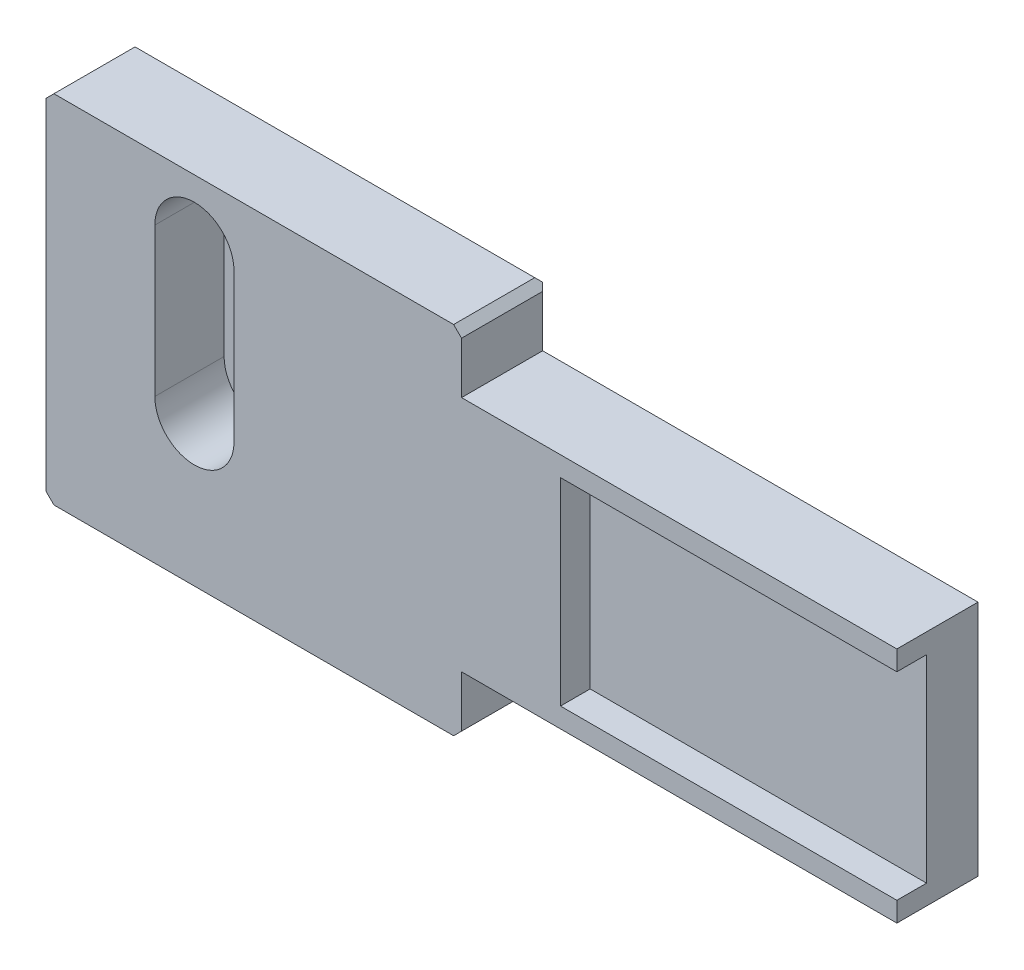
ISO-10303-21;
HEADER;
FILE_DESCRIPTION(('STEP AP214'),'2;1');
FILE_NAME('part.step','',(''),(''),'','','');
FILE_SCHEMA(('AUTOMOTIVE_DESIGN { 1 0 10303 214 1 1 1 1 }'));
ENDSEC;
DATA;
#1=APPLICATION_CONTEXT('core data for automotive mechanical design processes');
#2=APPLICATION_PROTOCOL_DEFINITION('international standard','automotive_design',2000,#1);
#3=PRODUCT_CONTEXT('',#1,'mechanical');
#4=PRODUCT('Part','Part','',(#3));
#5=PRODUCT_RELATED_PRODUCT_CATEGORY('part','',(#4));
#6=PRODUCT_DEFINITION_FORMATION('','',#4);
#7=PRODUCT_DEFINITION_CONTEXT('part definition',#1,'design');
#8=PRODUCT_DEFINITION('design','',#6,#7);
#9=PRODUCT_DEFINITION_SHAPE('','',#8);
#10=(LENGTH_UNIT() NAMED_UNIT(*) SI_UNIT(.MILLI.,.METRE.));
#11=(NAMED_UNIT(*) PLANE_ANGLE_UNIT() SI_UNIT($,.RADIAN.));
#12=(NAMED_UNIT(*) SI_UNIT($,.STERADIAN.) SOLID_ANGLE_UNIT());
#13=UNCERTAINTY_MEASURE_WITH_UNIT(LENGTH_MEASURE(1.E-05),#10,'distance_accuracy_value','');
#14=(GEOMETRIC_REPRESENTATION_CONTEXT(3) GLOBAL_UNCERTAINTY_ASSIGNED_CONTEXT((#13)) GLOBAL_UNIT_ASSIGNED_CONTEXT((#10,
#11,#12)) REPRESENTATION_CONTEXT('',''));
#15=CARTESIAN_POINT('',(0.,0.,0.));
#16=DIRECTION('',(0.,0.,1.));
#17=DIRECTION('',(1.,0.,0.));
#18=AXIS2_PLACEMENT_3D('',#15,#16,#17);
#19=CARTESIAN_POINT('',(0.,18.,4.5));
#20=DIRECTION('',(0.,1.,0.));
#21=DIRECTION('',(0.,0.,1.));
#22=AXIS2_PLACEMENT_3D('',#19,#20,#21);
#23=PLANE('',#22);
#24=DIRECTION('',(-1.,0.,0.));
#25=VECTOR('',#24,1.);
#26=CARTESIAN_POINT('',(0.,18.,0.400000000000005));
#27=LINE('',#26,#25);
#28=CARTESIAN_POINT('',(20.6,18.,0.400000000000005));
#29=VERTEX_POINT('',#28);
#30=CARTESIAN_POINT('',(0.400000000000005,18.,0.400000000000005));
#31=VERTEX_POINT('',#30);
#32=EDGE_CURVE('E395',#29,#31,#27,.T.);
#33=ORIENTED_EDGE('',*,*,#32,.T.);
#34=DIRECTION('',(0.,0.,1.));
#35=VECTOR('',#34,1.);
#36=CARTESIAN_POINT('',(0.400000000000005,18.,4.5));
#37=LINE('',#36,#35);
#38=CARTESIAN_POINT('',(0.400000000000005,18.,4.5));
#39=VERTEX_POINT('',#38);
#40=EDGE_CURVE('E493',#31,#39,#37,.T.);
#41=ORIENTED_EDGE('',*,*,#40,.T.);
#42=DIRECTION('',(1.,0.,0.));
#43=VECTOR('',#42,1.);
#44=CARTESIAN_POINT('',(0.,18.,4.5));
#45=LINE('',#44,#43);
#46=CARTESIAN_POINT('',(20.6,18.,4.5));
#47=VERTEX_POINT('',#46);
#48=EDGE_CURVE('E347',#39,#47,#45,.T.);
#49=ORIENTED_EDGE('',*,*,#48,.T.);
#50=DIRECTION('',(0.,0.,-1.));
#51=VECTOR('',#50,1.);
#52=CARTESIAN_POINT('',(20.6,18.,0.400000000000005));
#53=LINE('',#52,#51);
#54=EDGE_CURVE('E491',#47,#29,#53,.T.);
#55=ORIENTED_EDGE('',*,*,#54,.T.);
#56=EDGE_LOOP('',(#33,#41,#49,#55));
#57=FACE_BOUND('',#56,.T.);
#58=ADVANCED_FACE('F39',(#57),#23,.T.);
#59=CARTESIAN_POINT('',(0.,0.,4.5));
#60=DIRECTION('',(-1.,0.,0.));
#61=DIRECTION('',(0.,0.,1.));
#62=AXIS2_PLACEMENT_3D('',#59,#60,#61);
#63=PLANE('',#62);
#64=DIRECTION('',(0.,-1.,0.));
#65=VECTOR('',#64,1.);
#66=CARTESIAN_POINT('',(0.,0.,0.400000000000005));
#67=LINE('',#66,#65);
#68=CARTESIAN_POINT('',(0.,17.6,0.400000000000005));
#69=VERTEX_POINT('',#68);
#70=CARTESIAN_POINT('',(0.,0.399999999999998,0.400000000000005));
#71=VERTEX_POINT('',#70);
#72=EDGE_CURVE('E398',#69,#71,#67,.T.);
#73=ORIENTED_EDGE('',*,*,#72,.T.);
#74=DIRECTION('',(0.,0.,1.));
#75=VECTOR('',#74,1.);
#76=CARTESIAN_POINT('',(0.,0.399999999999998,4.5));
#77=LINE('',#76,#75);
#78=CARTESIAN_POINT('',(0.,0.399999999999998,4.5));
#79=VERTEX_POINT('',#78);
#80=EDGE_CURVE('E486',#71,#79,#77,.T.);
#81=ORIENTED_EDGE('',*,*,#80,.T.);
#82=DIRECTION('',(0.,1.,0.));
#83=VECTOR('',#82,1.);
#84=CARTESIAN_POINT('',(0.,0.,4.5));
#85=LINE('',#84,#83);
#86=CARTESIAN_POINT('',(0.,17.6,4.5));
#87=VERTEX_POINT('',#86);
#88=EDGE_CURVE('E357',#79,#87,#85,.T.);
#89=ORIENTED_EDGE('',*,*,#88,.T.);
#90=DIRECTION('',(0.,0.,-1.));
#91=VECTOR('',#90,1.);
#92=CARTESIAN_POINT('',(0.,17.6,4.5));
#93=LINE('',#92,#91);
#94=EDGE_CURVE('E483',#87,#69,#93,.T.);
#95=ORIENTED_EDGE('',*,*,#94,.T.);
#96=EDGE_LOOP('',(#73,#81,#89,#95));
#97=FACE_BOUND('',#96,.T.);
#98=ADVANCED_FACE('F529',(#97),#63,.T.);
#99=CARTESIAN_POINT('',(43.,0.,4.5));
#100=DIRECTION('',(0.,-1.,0.));
#101=DIRECTION('',(0.,0.,-1.));
#102=AXIS2_PLACEMENT_3D('',#99,#100,#101);
#103=PLANE('',#102);
#104=DIRECTION('',(1.,0.,0.));
#105=VECTOR('',#104,1.);
#106=CARTESIAN_POINT('',(43.,0.,0.400000000000005));
#107=LINE('',#106,#105);
#108=CARTESIAN_POINT('',(0.399999999999998,0.,0.400000000000005));
#109=VERTEX_POINT('',#108);
#110=CARTESIAN_POINT('',(20.6,0.,0.400000000000005));
#111=VERTEX_POINT('',#110);
#112=EDGE_CURVE('E401',#109,#111,#107,.T.);
#113=ORIENTED_EDGE('',*,*,#112,.T.);
#114=DIRECTION('',(0.,0.,1.));
#115=VECTOR('',#114,1.);
#116=CARTESIAN_POINT('',(20.6,0.,4.5));
#117=LINE('',#116,#115);
#118=CARTESIAN_POINT('',(20.6,0.,4.5));
#119=VERTEX_POINT('',#118);
#120=EDGE_CURVE('E460',#111,#119,#117,.T.);
#121=ORIENTED_EDGE('',*,*,#120,.T.);
#122=DIRECTION('',(-1.,0.,0.));
#123=VECTOR('',#122,1.);
#124=CARTESIAN_POINT('',(43.,0.,4.5));
#125=LINE('',#124,#123);
#126=CARTESIAN_POINT('',(0.399999999999998,0.,4.5));
#127=VERTEX_POINT('',#126);
#128=EDGE_CURVE('E354',#119,#127,#125,.T.);
#129=ORIENTED_EDGE('',*,*,#128,.T.);
#130=DIRECTION('',(0.,0.,-1.));
#131=VECTOR('',#130,1.);
#132=CARTESIAN_POINT('',(0.399999999999998,0.,4.5));
#133=LINE('',#132,#131);
#134=EDGE_CURVE('E423',#127,#109,#133,.T.);
#135=ORIENTED_EDGE('',*,*,#134,.T.);
#136=EDGE_LOOP('',(#113,#121,#129,#135));
#137=FACE_BOUND('',#136,.T.);
#138=ADVANCED_FACE('F535',(#137),#103,.T.);
#139=CARTESIAN_POINT('',(43.,18.,4.5));
#140=DIRECTION('',(1.,0.,0.));
#141=DIRECTION('',(0.,0.,-1.));
#142=AXIS2_PLACEMENT_3D('',#139,#140,#141);
#143=PLANE('',#142);
#144=DIRECTION('',(0.,0.,1.));
#145=VECTOR('',#144,1.);
#146=CARTESIAN_POINT('',(43.,3.,0.));
#147=LINE('',#146,#145);
#148=CARTESIAN_POINT('',(43.,3.,0.400000000000005));
#149=VERTEX_POINT('',#148);
#150=CARTESIAN_POINT('',(43.,3.,4.5));
#151=VERTEX_POINT('',#150);
#152=EDGE_CURVE('E344',#149,#151,#147,.T.);
#153=ORIENTED_EDGE('',*,*,#152,.F.);
#154=DIRECTION('',(0.,1.,0.));
#155=VECTOR('',#154,1.);
#156=CARTESIAN_POINT('',(43.,18.,0.400000000000005));
#157=LINE('',#156,#155);
#158=CARTESIAN_POINT('',(43.,15.,0.400000000000005));
#159=VERTEX_POINT('',#158);
#160=EDGE_CURVE('E408',#149,#159,#157,.T.);
#161=ORIENTED_EDGE('',*,*,#160,.T.);
#162=DIRECTION('',(0.,0.,1.));
#163=VECTOR('',#162,1.);
#164=CARTESIAN_POINT('',(43.,15.,0.));
#165=LINE('',#164,#163);
#166=CARTESIAN_POINT('',(43.,15.,4.5));
#167=VERTEX_POINT('',#166);
#168=EDGE_CURVE('E334',#159,#167,#165,.T.);
#169=ORIENTED_EDGE('',*,*,#168,.T.);
#170=DIRECTION('',(0.,-1.,0.));
#171=VECTOR('',#170,1.);
#172=CARTESIAN_POINT('',(43.,18.,4.5));
#173=LINE('',#172,#171);
#174=CARTESIAN_POINT('',(43.,14.,4.5));
#175=VERTEX_POINT('',#174);
#176=EDGE_CURVE('E351',#167,#175,#173,.T.);
#177=ORIENTED_EDGE('',*,*,#176,.T.);
#178=DIRECTION('',(0.,0.,1.));
#179=VECTOR('',#178,1.);
#180=CARTESIAN_POINT('',(43.,14.,3.));
#181=LINE('',#180,#179);
#182=CARTESIAN_POINT('',(43.,14.,3.));
#183=VERTEX_POINT('',#182);
#184=EDGE_CURVE('E269',#183,#175,#181,.T.);
#185=ORIENTED_EDGE('',*,*,#184,.F.);
#186=DIRECTION('',(0.,1.,0.));
#187=VECTOR('',#186,1.);
#188=CARTESIAN_POINT('',(43.,4.,3.));
#189=LINE('',#188,#187);
#190=CARTESIAN_POINT('',(43.,4.,3.));
#191=VERTEX_POINT('',#190);
#192=EDGE_CURVE('E621',#191,#183,#189,.T.);
#193=ORIENTED_EDGE('',*,*,#192,.F.);
#194=DIRECTION('',(0.,0.,-1.));
#195=VECTOR('',#194,1.);
#196=CARTESIAN_POINT('',(43.,4.,4.5));
#197=LINE('',#196,#195);
#198=CARTESIAN_POINT('',(43.,4.,4.5));
#199=VERTEX_POINT('',#198);
#200=EDGE_CURVE('E448',#199,#191,#197,.T.);
#201=ORIENTED_EDGE('',*,*,#200,.F.);
#202=EDGE_CURVE('E276',#199,#151,#173,.T.);
#203=ORIENTED_EDGE('',*,*,#202,.T.);
#204=EDGE_LOOP('',(#153,#161,#169,#177,#185,#193,#201,#203));
#205=FACE_BOUND('',#204,.T.);
#206=ADVANCED_FACE('F539',(#205),#143,.T.);
#207=CARTESIAN_POINT('',(0.,0.,4.5));
#208=DIRECTION('',(0.,0.,-1.));
#209=DIRECTION('',(-1.,0.,0.));
#210=AXIS2_PLACEMENT_3D('',#207,#208,#209);
#211=PLANE('',#210);
#212=DIRECTION('',(0.,-1.,0.));
#213=VECTOR('',#212,1.);
#214=CARTESIAN_POINT('',(5.5,14.8,4.5));
#215=LINE('',#214,#213);
#216=CARTESIAN_POINT('',(5.5,14.8,4.5));
#217=VERTEX_POINT('',#216);
#218=CARTESIAN_POINT('',(5.5,7.3,4.5));
#219=VERTEX_POINT('',#218);
#220=EDGE_CURVE('E312',#217,#219,#215,.T.);
#221=ORIENTED_EDGE('',*,*,#220,.F.);
#222=CARTESIAN_POINT('',(7.5,14.8,4.5));
#223=DIRECTION('',(0.,0.,1.));
#224=DIRECTION('',(1.,0.,0.));
#225=AXIS2_PLACEMENT_3D('',#222,#223,#224);
#226=CIRCLE('',#225,2.);
#227=CARTESIAN_POINT('',(9.5,14.8,4.5));
#228=VERTEX_POINT('',#227);
#229=EDGE_CURVE('E286',#228,#217,#226,.T.);
#230=ORIENTED_EDGE('',*,*,#229,.F.);
#231=DIRECTION('',(0.,1.,0.));
#232=VECTOR('',#231,1.);
#233=CARTESIAN_POINT('',(9.5,14.8,4.5));
#234=LINE('',#233,#232);
#235=CARTESIAN_POINT('',(9.5,7.3,4.5));
#236=VERTEX_POINT('',#235);
#237=EDGE_CURVE('E301',#236,#228,#234,.T.);
#238=ORIENTED_EDGE('',*,*,#237,.F.);
#239=CARTESIAN_POINT('',(7.5,7.3,4.5));
#240=DIRECTION('',(0.,0.,1.));
#241=DIRECTION('',(1.,0.,0.));
#242=AXIS2_PLACEMENT_3D('',#239,#240,#241);
#243=CIRCLE('',#242,2.);
#244=EDGE_CURVE('E315',#219,#236,#243,.T.);
#245=ORIENTED_EDGE('',*,*,#244,.F.);
#246=EDGE_LOOP('',(#221,#230,#238,#245));
#247=FACE_BOUND('',#246,.T.);
#248=ORIENTED_EDGE('',*,*,#128,.F.);
#249=DIRECTION('',(0.707106781186554,0.707106781186541,0.));
#250=VECTOR('',#249,1.);
#251=CARTESIAN_POINT('',(20.6,0.,4.5));
#252=LINE('',#251,#250);
#253=CARTESIAN_POINT('',(21.,0.400000000000005,4.5));
#254=VERTEX_POINT('',#253);
#255=EDGE_CURVE('E469',#119,#254,#252,.T.);
#256=ORIENTED_EDGE('',*,*,#255,.T.);
#257=DIRECTION('',(0.,-1.,0.));
#258=VECTOR('',#257,1.);
#259=CARTESIAN_POINT('',(21.,3.,4.5));
#260=LINE('',#259,#258);
#261=CARTESIAN_POINT('',(21.,3.,4.5));
#262=VERTEX_POINT('',#261);
#263=EDGE_CURVE('E341',#262,#254,#260,.T.);
#264=ORIENTED_EDGE('',*,*,#263,.F.);
#265=DIRECTION('',(-1.,0.,0.));
#266=VECTOR('',#265,1.);
#267=CARTESIAN_POINT('',(43.,3.,4.5));
#268=LINE('',#267,#266);
#269=EDGE_CURVE('E336',#151,#262,#268,.T.);
#270=ORIENTED_EDGE('',*,*,#269,.F.);
#271=ORIENTED_EDGE('',*,*,#202,.F.);
#272=DIRECTION('',(1.,0.,0.));
#273=VECTOR('',#272,1.);
#274=CARTESIAN_POINT('',(26.,4.,4.5));
#275=LINE('',#274,#273);
#276=CARTESIAN_POINT('',(26.,4.,4.5));
#277=VERTEX_POINT('',#276);
#278=EDGE_CURVE('E253',#277,#199,#275,.T.);
#279=ORIENTED_EDGE('',*,*,#278,.F.);
#280=DIRECTION('',(0.,-1.,0.));
#281=VECTOR('',#280,1.);
#282=CARTESIAN_POINT('',(26.,14.,4.5));
#283=LINE('',#282,#281);
#284=CARTESIAN_POINT('',(26.,14.,4.5));
#285=VERTEX_POINT('',#284);
#286=EDGE_CURVE('E260',#285,#277,#283,.T.);
#287=ORIENTED_EDGE('',*,*,#286,.F.);
#288=DIRECTION('',(1.,0.,0.));
#289=VECTOR('',#288,1.);
#290=CARTESIAN_POINT('',(26.,14.,4.5));
#291=LINE('',#290,#289);
#292=EDGE_CURVE('E296',#285,#175,#291,.T.);
#293=ORIENTED_EDGE('',*,*,#292,.T.);
#294=ORIENTED_EDGE('',*,*,#176,.F.);
#295=DIRECTION('',(1.,0.,0.));
#296=VECTOR('',#295,1.);
#297=CARTESIAN_POINT('',(21.,15.,4.5));
#298=LINE('',#297,#296);
#299=CARTESIAN_POINT('',(21.,15.,4.5));
#300=VERTEX_POINT('',#299);
#301=EDGE_CURVE('E330',#300,#167,#298,.T.);
#302=ORIENTED_EDGE('',*,*,#301,.F.);
#303=DIRECTION('',(0.,-1.,0.));
#304=VECTOR('',#303,1.);
#305=CARTESIAN_POINT('',(21.,18.,4.5));
#306=LINE('',#305,#304);
#307=CARTESIAN_POINT('',(21.,17.6,4.5));
#308=VERTEX_POINT('',#307);
#309=EDGE_CURVE('E322',#308,#300,#306,.T.);
#310=ORIENTED_EDGE('',*,*,#309,.F.);
#311=DIRECTION('',(-0.707106781186548,0.707106781186548,0.));
#312=VECTOR('',#311,1.);
#313=CARTESIAN_POINT('',(21.,17.6,4.5));
#314=LINE('',#313,#312);
#315=EDGE_CURVE('E463',#308,#47,#314,.T.);
#316=ORIENTED_EDGE('',*,*,#315,.T.);
#317=ORIENTED_EDGE('',*,*,#48,.F.);
#318=DIRECTION('',(0.707106781186541,0.707106781186554,0.));
#319=VECTOR('',#318,1.);
#320=CARTESIAN_POINT('',(0.,17.6,4.5));
#321=LINE('',#320,#319);
#322=EDGE_CURVE('E465',#39,#87,#321,.F.);
#323=ORIENTED_EDGE('',*,*,#322,.T.);
#324=ORIENTED_EDGE('',*,*,#88,.F.);
#325=DIRECTION('',(-0.707106781186548,0.707106781186548,0.));
#326=VECTOR('',#325,1.);
#327=CARTESIAN_POINT('',(0.399999999999998,0.,4.5));
#328=LINE('',#327,#326);
#329=EDGE_CURVE('E467',#79,#127,#328,.F.);
#330=ORIENTED_EDGE('',*,*,#329,.T.);
#331=EDGE_LOOP('',(#248,#256,#264,#270,#271,#279,#287,#293,#294,#302,#310,#316,#317,#323,#324,#330));
#332=FACE_BOUND('',#331,.T.);
#333=ADVANCED_FACE('F273',(#247,#332),#211,.F.);
#334=CARTESIAN_POINT('',(0.,0.,0.));
#335=DIRECTION('',(0.,0.,-1.));
#336=DIRECTION('',(-1.,0.,0.));
#337=AXIS2_PLACEMENT_3D('',#334,#335,#336);
#338=PLANE('',#337);
#339=DIRECTION('',(0.,1.,0.));
#340=VECTOR('',#339,1.);
#341=CARTESIAN_POINT('',(0.400000000000011,0.,0.));
#342=LINE('',#341,#340);
#343=CARTESIAN_POINT('',(0.400000000000011,0.400000000000011,0.));
#344=VERTEX_POINT('',#343);
#345=CARTESIAN_POINT('',(0.400000000000011,17.6,0.));
#346=VERTEX_POINT('',#345);
#347=EDGE_CURVE('E390',#344,#346,#342,.T.);
#348=ORIENTED_EDGE('',*,*,#347,.T.);
#349=DIRECTION('',(1.,0.,0.));
#350=VECTOR('',#349,1.);
#351=CARTESIAN_POINT('',(0.,17.6,0.));
#352=LINE('',#351,#350);
#353=CARTESIAN_POINT('',(20.6,17.6,0.));
#354=VERTEX_POINT('',#353);
#355=EDGE_CURVE('E392',#346,#354,#352,.T.);
#356=ORIENTED_EDGE('',*,*,#355,.T.);
#357=DIRECTION('',(0.,-1.,0.));
#358=VECTOR('',#357,1.);
#359=CARTESIAN_POINT('',(20.6,15.,0.));
#360=LINE('',#359,#358);
#361=CARTESIAN_POINT('',(20.6,14.6,0.));
#362=VERTEX_POINT('',#361);
#363=EDGE_CURVE('E378',#354,#362,#360,.T.);
#364=ORIENTED_EDGE('',*,*,#363,.T.);
#365=DIRECTION('',(1.,0.,0.));
#366=VECTOR('',#365,1.);
#367=CARTESIAN_POINT('',(43.,14.6,0.));
#368=LINE('',#367,#366);
#369=CARTESIAN_POINT('',(42.6,14.6,0.));
#370=VERTEX_POINT('',#369);
#371=EDGE_CURVE('E380',#362,#370,#368,.T.);
#372=ORIENTED_EDGE('',*,*,#371,.T.);
#373=DIRECTION('',(0.,-1.,0.));
#374=VECTOR('',#373,1.);
#375=CARTESIAN_POINT('',(42.6,0.,0.));
#376=LINE('',#375,#374);
#377=CARTESIAN_POINT('',(42.6,3.40000000000001,0.));
#378=VERTEX_POINT('',#377);
#379=EDGE_CURVE('E382',#370,#378,#376,.T.);
#380=ORIENTED_EDGE('',*,*,#379,.T.);
#381=DIRECTION('',(-1.,0.,0.));
#382=VECTOR('',#381,1.);
#383=CARTESIAN_POINT('',(21.,3.40000000000001,0.));
#384=LINE('',#383,#382);
#385=CARTESIAN_POINT('',(20.6,3.40000000000001,0.));
#386=VERTEX_POINT('',#385);
#387=EDGE_CURVE('E384',#378,#386,#384,.T.);
#388=ORIENTED_EDGE('',*,*,#387,.T.);
#389=DIRECTION('',(0.,-1.,0.));
#390=VECTOR('',#389,1.);
#391=CARTESIAN_POINT('',(20.6,0.,0.));
#392=LINE('',#391,#390);
#393=CARTESIAN_POINT('',(20.6,0.400000000000011,0.));
#394=VERTEX_POINT('',#393);
#395=EDGE_CURVE('E386',#386,#394,#392,.T.);
#396=ORIENTED_EDGE('',*,*,#395,.T.);
#397=DIRECTION('',(-1.,0.,0.));
#398=VECTOR('',#397,1.);
#399=CARTESIAN_POINT('',(0.,0.400000000000011,0.));
#400=LINE('',#399,#398);
#401=EDGE_CURVE('E388',#394,#344,#400,.T.);
#402=ORIENTED_EDGE('',*,*,#401,.T.);
#403=EDGE_LOOP('',(#348,#356,#364,#372,#380,#388,#396,#402));
#404=FACE_BOUND('',#403,.T.);
#405=CARTESIAN_POINT('',(7.500621497631,7.2750770498065,0.));
#406=DIRECTION('',(0.,0.,-1.));
#407=DIRECTION('',(-1.,0.,0.));
#408=AXIS2_PLACEMENT_3D('',#405,#406,#407);
#409=CIRCLE('',#408,1.60000000000001);
#410=CARTESIAN_POINT('',(5.90062150308813,7.27494490277818,0.));
#411=VERTEX_POINT('',#410);
#412=CARTESIAN_POINT('',(9.10062149217388,7.27520919683482,0.));
#413=VERTEX_POINT('',#412);
#414=EDGE_CURVE('E373',#411,#413,#409,.F.);
#415=ORIENTED_EDGE('',*,*,#414,.T.);
#416=DIRECTION('',(-8.25918927004971E-05,0.99999999658929,0.));
#417=VECTOR('',#416,1.);
#418=CARTESIAN_POINT('',(9.09999999454288,14.8001321470283,0.));
#419=LINE('',#418,#417);
#420=CARTESIAN_POINT('',(9.09999999454288,14.8001321470283,0.));
#421=VERTEX_POINT('',#420);
#422=EDGE_CURVE('E375',#413,#421,#419,.T.);
#423=ORIENTED_EDGE('',*,*,#422,.T.);
#424=CARTESIAN_POINT('',(7.5,14.8,0.));
#425=DIRECTION('',(0.,0.,-1.));
#426=DIRECTION('',(-1.,0.,0.));
#427=AXIS2_PLACEMENT_3D('',#424,#425,#426);
#428=CIRCLE('',#427,1.60000000000001);
#429=CARTESIAN_POINT('',(5.90000000545712,14.7998678529717,0.));
#430=VERTEX_POINT('',#429);
#431=EDGE_CURVE('E369',#421,#430,#428,.F.);
#432=ORIENTED_EDGE('',*,*,#431,.T.);
#433=DIRECTION('',(8.25918927004972E-05,-0.99999999658929,0.));
#434=VECTOR('',#433,1.);
#435=CARTESIAN_POINT('',(5.90062150308813,7.27494490277818,0.));
#436=LINE('',#435,#434);
#437=EDGE_CURVE('E371',#430,#411,#436,.T.);
#438=ORIENTED_EDGE('',*,*,#437,.T.);
#439=EDGE_LOOP('',(#415,#423,#432,#438));
#440=FACE_BOUND('',#439,.T.);
#441=ADVANCED_FACE('F637',(#404,#440),#338,.T.);
#442=CARTESIAN_POINT('',(21.,3.,0.));
#443=DIRECTION('',(-1.,0.,0.));
#444=DIRECTION('',(0.,0.,1.));
#445=AXIS2_PLACEMENT_3D('',#442,#443,#444);
#446=PLANE('',#445);
#447=ORIENTED_EDGE('',*,*,#263,.T.);
#448=DIRECTION('',(0.,0.,-1.));
#449=VECTOR('',#448,1.);
#450=CARTESIAN_POINT('',(21.,0.400000000000005,0.400000000000005));
#451=LINE('',#450,#449);
#452=CARTESIAN_POINT('',(21.,0.400000000000005,0.400000000000005));
#453=VERTEX_POINT('',#452);
#454=EDGE_CURVE('E471',#254,#453,#451,.T.);
#455=ORIENTED_EDGE('',*,*,#454,.T.);
#456=DIRECTION('',(0.,1.,0.));
#457=VECTOR('',#456,1.);
#458=CARTESIAN_POINT('',(21.,3.,0.400000000000005));
#459=LINE('',#458,#457);
#460=CARTESIAN_POINT('',(21.,3.,0.400000000000005));
#461=VERTEX_POINT('',#460);
#462=EDGE_CURVE('E404',#453,#461,#459,.T.);
#463=ORIENTED_EDGE('',*,*,#462,.T.);
#464=DIRECTION('',(0.,0.,1.));
#465=VECTOR('',#464,1.);
#466=CARTESIAN_POINT('',(21.,3.,0.));
#467=LINE('',#466,#465);
#468=EDGE_CURVE('E345',#461,#262,#467,.T.);
#469=ORIENTED_EDGE('',*,*,#468,.T.);
#470=EDGE_LOOP('',(#447,#455,#463,#469));
#471=FACE_BOUND('',#470,.T.);
#472=ADVANCED_FACE('F609',(#471),#446,.F.);
#473=CARTESIAN_POINT('',(43.,3.,0.));
#474=DIRECTION('',(0.,1.,0.));
#475=DIRECTION('',(0.,0.,1.));
#476=AXIS2_PLACEMENT_3D('',#473,#474,#475);
#477=PLANE('',#476);
#478=ORIENTED_EDGE('',*,*,#468,.F.);
#479=DIRECTION('',(1.,0.,0.));
#480=VECTOR('',#479,1.);
#481=CARTESIAN_POINT('',(43.,3.,0.400000000000005));
#482=LINE('',#481,#480);
#483=EDGE_CURVE('E406',#461,#149,#482,.T.);
#484=ORIENTED_EDGE('',*,*,#483,.T.);
#485=ORIENTED_EDGE('',*,*,#152,.T.);
#486=ORIENTED_EDGE('',*,*,#269,.T.);
#487=EDGE_LOOP('',(#478,#484,#485,#486));
#488=FACE_BOUND('',#487,.T.);
#489=ADVANCED_FACE('F614',(#488),#477,.F.);
#490=CARTESIAN_POINT('',(21.,18.,0.));
#491=DIRECTION('',(-1.,0.,0.));
#492=DIRECTION('',(0.,0.,1.));
#493=AXIS2_PLACEMENT_3D('',#490,#491,#492);
#494=PLANE('',#493);
#495=DIRECTION('',(0.,1.,0.));
#496=VECTOR('',#495,1.);
#497=CARTESIAN_POINT('',(21.,18.,0.400000000000005));
#498=LINE('',#497,#496);
#499=CARTESIAN_POINT('',(21.,15.,0.400000000000005));
#500=VERTEX_POINT('',#499);
#501=CARTESIAN_POINT('',(21.,17.6,0.400000000000005));
#502=VERTEX_POINT('',#501);
#503=EDGE_CURVE('E412',#500,#502,#498,.T.);
#504=ORIENTED_EDGE('',*,*,#503,.T.);
#505=DIRECTION('',(0.,0.,1.));
#506=VECTOR('',#505,1.);
#507=CARTESIAN_POINT('',(21.,17.6,4.5));
#508=LINE('',#507,#506);
#509=EDGE_CURVE('E48',#502,#308,#508,.T.);
#510=ORIENTED_EDGE('',*,*,#509,.T.);
#511=ORIENTED_EDGE('',*,*,#309,.T.);
#512=DIRECTION('',(0.,0.,1.));
#513=VECTOR('',#512,1.);
#514=CARTESIAN_POINT('',(21.,15.,0.));
#515=LINE('',#514,#513);
#516=EDGE_CURVE('E333',#500,#300,#515,.T.);
#517=ORIENTED_EDGE('',*,*,#516,.F.);
#518=EDGE_LOOP('',(#504,#510,#511,#517));
#519=FACE_BOUND('',#518,.T.);
#520=ADVANCED_FACE('F498',(#519),#494,.F.);
#521=CARTESIAN_POINT('',(21.,15.,0.));
#522=DIRECTION('',(0.,-1.,0.));
#523=DIRECTION('',(0.,0.,-1.));
#524=AXIS2_PLACEMENT_3D('',#521,#522,#523);
#525=PLANE('',#524);
#526=ORIENTED_EDGE('',*,*,#168,.F.);
#527=DIRECTION('',(-1.,0.,0.));
#528=VECTOR('',#527,1.);
#529=CARTESIAN_POINT('',(21.,15.,0.400000000000005));
#530=LINE('',#529,#528);
#531=EDGE_CURVE('E410',#159,#500,#530,.T.);
#532=ORIENTED_EDGE('',*,*,#531,.T.);
#533=ORIENTED_EDGE('',*,*,#516,.T.);
#534=ORIENTED_EDGE('',*,*,#301,.T.);
#535=EDGE_LOOP('',(#526,#532,#533,#534));
#536=FACE_BOUND('',#535,.T.);
#537=ADVANCED_FACE('F506',(#536),#525,.F.);
#538=CARTESIAN_POINT('',(7.5,14.8,1.));
#539=DIRECTION('',(0.,0.,1.));
#540=DIRECTION('',(1.,0.,0.));
#541=AXIS2_PLACEMENT_3D('',#538,#539,#540);
#542=CYLINDRICAL_SURFACE('',#541,2.);
#543=ORIENTED_EDGE('',*,*,#229,.T.);
#544=DIRECTION('',(0.,0.,1.));
#545=VECTOR('',#544,1.);
#546=CARTESIAN_POINT('',(5.5,14.8,1.));
#547=LINE('',#546,#545);
#548=CARTESIAN_POINT('',(5.5,14.8,1.));
#549=VERTEX_POINT('',#548);
#550=EDGE_CURVE('E310',#549,#217,#547,.T.);
#551=ORIENTED_EDGE('',*,*,#550,.F.);
#552=CARTESIAN_POINT('',(7.5,14.8,1.));
#553=DIRECTION('',(0.,0.,1.));
#554=DIRECTION('',(1.,0.,0.));
#555=AXIS2_PLACEMENT_3D('',#552,#553,#554);
#556=CIRCLE('',#555,2.);
#557=CARTESIAN_POINT('',(9.5,14.8,1.));
#558=VERTEX_POINT('',#557);
#559=EDGE_CURVE('E297',#558,#549,#556,.T.);
#560=ORIENTED_EDGE('',*,*,#559,.F.);
#561=DIRECTION('',(0.,0.,1.));
#562=VECTOR('',#561,1.);
#563=CARTESIAN_POINT('',(9.5,14.8,1.));
#564=LINE('',#563,#562);
#565=EDGE_CURVE('E320',#558,#228,#564,.T.);
#566=ORIENTED_EDGE('',*,*,#565,.T.);
#567=EDGE_LOOP('',(#543,#551,#560,#566));
#568=FACE_BOUND('',#567,.T.);
#569=ADVANCED_FACE('F716',(#568),#542,.F.);
#570=CARTESIAN_POINT('',(9.5,14.8,1.));
#571=DIRECTION('',(1.,0.,0.));
#572=DIRECTION('',(0.,0.,-1.));
#573=AXIS2_PLACEMENT_3D('',#570,#571,#572);
#574=PLANE('',#573);
#575=ORIENTED_EDGE('',*,*,#237,.T.);
#576=ORIENTED_EDGE('',*,*,#565,.F.);
#577=DIRECTION('',(0.,1.,0.));
#578=VECTOR('',#577,1.);
#579=CARTESIAN_POINT('',(9.5,14.8,1.));
#580=LINE('',#579,#578);
#581=CARTESIAN_POINT('',(9.5,7.3,1.));
#582=VERTEX_POINT('',#581);
#583=EDGE_CURVE('E307',#582,#558,#580,.T.);
#584=ORIENTED_EDGE('',*,*,#583,.F.);
#585=DIRECTION('',(0.,0.,1.));
#586=VECTOR('',#585,1.);
#587=CARTESIAN_POINT('',(9.5,7.3,1.));
#588=LINE('',#587,#586);
#589=EDGE_CURVE('E323',#582,#236,#588,.T.);
#590=ORIENTED_EDGE('',*,*,#589,.T.);
#591=EDGE_LOOP('',(#575,#576,#584,#590));
#592=FACE_BOUND('',#591,.T.);
#593=ADVANCED_FACE('F712',(#592),#574,.F.);
#594=CARTESIAN_POINT('',(7.5,7.3,1.));
#595=DIRECTION('',(0.,0.,1.));
#596=DIRECTION('',(1.,0.,0.));
#597=AXIS2_PLACEMENT_3D('',#594,#595,#596);
#598=CYLINDRICAL_SURFACE('',#597,2.);
#599=ORIENTED_EDGE('',*,*,#244,.T.);
#600=ORIENTED_EDGE('',*,*,#589,.F.);
#601=CARTESIAN_POINT('',(7.5,7.3,1.));
#602=DIRECTION('',(0.,0.,1.));
#603=DIRECTION('',(1.,0.,0.));
#604=AXIS2_PLACEMENT_3D('',#601,#602,#603);
#605=CIRCLE('',#604,2.);
#606=CARTESIAN_POINT('',(5.5,7.3,1.));
#607=VERTEX_POINT('',#606);
#608=EDGE_CURVE('E304',#607,#582,#605,.T.);
#609=ORIENTED_EDGE('',*,*,#608,.F.);
#610=DIRECTION('',(0.,0.,1.));
#611=VECTOR('',#610,1.);
#612=CARTESIAN_POINT('',(5.5,7.3,1.));
#613=LINE('',#612,#611);
#614=EDGE_CURVE('E325',#607,#219,#613,.T.);
#615=ORIENTED_EDGE('',*,*,#614,.T.);
#616=EDGE_LOOP('',(#599,#600,#609,#615));
#617=FACE_BOUND('',#616,.T.);
#618=ADVANCED_FACE('F715',(#617),#598,.F.);
#619=CARTESIAN_POINT('',(5.5,14.8,1.));
#620=DIRECTION('',(-1.,0.,0.));
#621=DIRECTION('',(0.,0.,1.));
#622=AXIS2_PLACEMENT_3D('',#619,#620,#621);
#623=PLANE('',#622);
#624=ORIENTED_EDGE('',*,*,#220,.T.);
#625=ORIENTED_EDGE('',*,*,#614,.F.);
#626=DIRECTION('',(0.,-1.,0.));
#627=VECTOR('',#626,1.);
#628=CARTESIAN_POINT('',(5.5,14.8,1.));
#629=LINE('',#628,#627);
#630=EDGE_CURVE('E300',#549,#607,#629,.T.);
#631=ORIENTED_EDGE('',*,*,#630,.F.);
#632=ORIENTED_EDGE('',*,*,#550,.T.);
#633=EDGE_LOOP('',(#624,#625,#631,#632));
#634=FACE_BOUND('',#633,.T.);
#635=ADVANCED_FACE('F710',(#634),#623,.F.);
#636=CARTESIAN_POINT('',(7.5,14.8,1.));
#637=DIRECTION('',(0.,0.,1.));
#638=DIRECTION('',(1.,0.,0.));
#639=AXIS2_PLACEMENT_3D('',#636,#637,#638);
#640=PLANE('',#639);
#641=CARTESIAN_POINT('',(7.5,14.8,1.));
#642=DIRECTION('',(0.,0.,1.));
#643=DIRECTION('',(1.,0.,0.));
#644=AXIS2_PLACEMENT_3D('',#641,#642,#643);
#645=CIRCLE('',#644,1.2);
#646=CARTESIAN_POINT('',(8.69999999590715,14.8000991102712,1.));
#647=VERTEX_POINT('',#646);
#648=CARTESIAN_POINT('',(6.30000000409285,14.7999008897288,1.));
#649=VERTEX_POINT('',#648);
#650=EDGE_CURVE('E367',#647,#649,#645,.T.);
#651=ORIENTED_EDGE('',*,*,#650,.F.);
#652=DIRECTION('',(-8.25918927004971E-05,0.99999999658929,0.));
#653=VECTOR('',#652,1.);
#654=CARTESIAN_POINT('',(8.69999999590715,14.8000991102712,1.));
#655=LINE('',#654,#653);
#656=CARTESIAN_POINT('',(8.70062149353815,7.27517616007774,1.));
#657=VERTEX_POINT('',#656);
#658=EDGE_CURVE('E360',#657,#647,#655,.T.);
#659=ORIENTED_EDGE('',*,*,#658,.F.);
#660=CARTESIAN_POINT('',(7.500621497631,7.2750770498065,1.));
#661=DIRECTION('',(0.,0.,1.));
#662=DIRECTION('',(1.,0.,0.));
#663=AXIS2_PLACEMENT_3D('',#660,#661,#662);
#664=CIRCLE('',#663,1.2);
#665=CARTESIAN_POINT('',(6.30062150172385,7.27497793953526,1.));
#666=VERTEX_POINT('',#665);
#667=EDGE_CURVE('E362',#666,#657,#664,.T.);
#668=ORIENTED_EDGE('',*,*,#667,.F.);
#669=DIRECTION('',(8.25918927004972E-05,-0.99999999658929,0.));
#670=VECTOR('',#669,1.);
#671=CARTESIAN_POINT('',(6.30000000409285,14.7999008897288,1.));
#672=LINE('',#671,#670);
#673=EDGE_CURVE('E365',#649,#666,#672,.T.);
#674=ORIENTED_EDGE('',*,*,#673,.F.);
#675=EDGE_LOOP('',(#651,#659,#668,#674));
#676=FACE_BOUND('',#675,.T.);
#677=ORIENTED_EDGE('',*,*,#559,.T.);
#678=ORIENTED_EDGE('',*,*,#630,.T.);
#679=ORIENTED_EDGE('',*,*,#608,.T.);
#680=ORIENTED_EDGE('',*,*,#583,.T.);
#681=EDGE_LOOP('',(#677,#678,#679,#680));
#682=FACE_BOUND('',#681,.T.);
#683=ADVANCED_FACE('F706',(#676,#682),#640,.T.);
#684=CARTESIAN_POINT('',(7.5,14.8,4.5));
#685=DIRECTION('',(0.,0.,-1.));
#686=DIRECTION('',(-1.,0.,0.));
#687=AXIS2_PLACEMENT_3D('',#684,#685,#686);
#688=CYLINDRICAL_SURFACE('',#687,1.2);
#689=DIRECTION('',(0.,0.,-1.));
#690=VECTOR('',#689,1.);
#691=CARTESIAN_POINT('',(6.30000000409285,14.7999008897288,4.5));
#692=LINE('',#691,#690);
#693=CARTESIAN_POINT('',(6.30000000409285,14.7999008897288,0.400000000000013));
#694=VERTEX_POINT('',#693);
#695=EDGE_CURVE('E283',#649,#694,#692,.T.);
#696=ORIENTED_EDGE('',*,*,#695,.T.);
#697=CARTESIAN_POINT('',(7.5,14.8,0.400000000000013));
#698=DIRECTION('',(0.,0.,-1.));
#699=DIRECTION('',(-1.,0.,0.));
#700=AXIS2_PLACEMENT_3D('',#697,#698,#699);
#701=CIRCLE('',#700,1.2);
#702=CARTESIAN_POINT('',(8.69999999590715,14.8000991102712,0.400000000000013));
#703=VERTEX_POINT('',#702);
#704=EDGE_CURVE('E421',#694,#703,#701,.T.);
#705=ORIENTED_EDGE('',*,*,#704,.T.);
#706=DIRECTION('',(0.,0.,-1.));
#707=VECTOR('',#706,1.);
#708=CARTESIAN_POINT('',(8.69999999590715,14.8000991102712,4.5));
#709=LINE('',#708,#707);
#710=EDGE_CURVE('E293',#647,#703,#709,.T.);
#711=ORIENTED_EDGE('',*,*,#710,.F.);
#712=ORIENTED_EDGE('',*,*,#650,.T.);
#713=EDGE_LOOP('',(#696,#705,#711,#712));
#714=FACE_BOUND('',#713,.T.);
#715=ADVANCED_FACE('F696',(#714),#688,.F.);
#716=CARTESIAN_POINT('',(6.30000000409285,14.7999008897288,4.5));
#717=DIRECTION('',(-0.99999999658929,-8.25918927004972E-05,0.));
#718=DIRECTION('',(8.25918927004972E-05,-0.99999999658929,0.));
#719=AXIS2_PLACEMENT_3D('',#716,#717,#718);
#720=PLANE('',#719);
#721=DIRECTION('',(0.,0.,-1.));
#722=VECTOR('',#721,1.);
#723=CARTESIAN_POINT('',(6.30062150172385,7.27497793953526,4.5));
#724=LINE('',#723,#722);
#725=CARTESIAN_POINT('',(6.30062150172385,7.27497793953526,0.400000000000013));
#726=VERTEX_POINT('',#725);
#727=EDGE_CURVE('E287',#666,#726,#724,.T.);
#728=ORIENTED_EDGE('',*,*,#727,.T.);
#729=DIRECTION('',(-8.25918927004972E-05,0.99999999658929,0.));
#730=VECTOR('',#729,1.);
#731=CARTESIAN_POINT('',(6.30000000409285,14.7999008897288,0.400000000000013));
#732=LINE('',#731,#730);
#733=EDGE_CURVE('E419',#726,#694,#732,.T.);
#734=ORIENTED_EDGE('',*,*,#733,.T.);
#735=ORIENTED_EDGE('',*,*,#695,.F.);
#736=ORIENTED_EDGE('',*,*,#673,.T.);
#737=EDGE_LOOP('',(#728,#734,#735,#736));
#738=FACE_BOUND('',#737,.T.);
#739=ADVANCED_FACE('F692',(#738),#720,.F.);
#740=CARTESIAN_POINT('',(7.500621497631,7.2750770498065,4.5));
#741=DIRECTION('',(0.,0.,-1.));
#742=DIRECTION('',(-1.,0.,0.));
#743=AXIS2_PLACEMENT_3D('',#740,#741,#742);
#744=CYLINDRICAL_SURFACE('',#743,1.2);
#745=DIRECTION('',(0.,0.,-1.));
#746=VECTOR('',#745,1.);
#747=CARTESIAN_POINT('',(8.70062149353815,7.27517616007774,4.5));
#748=LINE('',#747,#746);
#749=CARTESIAN_POINT('',(8.70062149353815,7.27517616007774,0.400000000000013));
#750=VERTEX_POINT('',#749);
#751=EDGE_CURVE('E290',#657,#750,#748,.T.);
#752=ORIENTED_EDGE('',*,*,#751,.T.);
#753=CARTESIAN_POINT('',(7.500621497631,7.2750770498065,0.400000000000013));
#754=DIRECTION('',(0.,0.,-1.));
#755=DIRECTION('',(-1.,0.,0.));
#756=AXIS2_PLACEMENT_3D('',#753,#754,#755);
#757=CIRCLE('',#756,1.2);
#758=EDGE_CURVE('E417',#750,#726,#757,.T.);
#759=ORIENTED_EDGE('',*,*,#758,.T.);
#760=ORIENTED_EDGE('',*,*,#727,.F.);
#761=ORIENTED_EDGE('',*,*,#667,.T.);
#762=EDGE_LOOP('',(#752,#759,#760,#761));
#763=FACE_BOUND('',#762,.T.);
#764=ADVANCED_FACE('F695',(#763),#744,.F.);
#765=CARTESIAN_POINT('',(8.69999999590715,14.8000991102712,4.5));
#766=DIRECTION('',(0.99999999658929,8.25918927004971E-05,0.));
#767=DIRECTION('',(-8.25918927004971E-05,0.99999999658929,0.));
#768=AXIS2_PLACEMENT_3D('',#765,#766,#767);
#769=PLANE('',#768);
#770=ORIENTED_EDGE('',*,*,#710,.T.);
#771=DIRECTION('',(8.25918927004971E-05,-0.99999999658929,0.));
#772=VECTOR('',#771,1.);
#773=CARTESIAN_POINT('',(8.70062149353815,7.27517616007774,0.400000000000013));
#774=LINE('',#773,#772);
#775=EDGE_CURVE('E414',#703,#750,#774,.T.);
#776=ORIENTED_EDGE('',*,*,#775,.T.);
#777=ORIENTED_EDGE('',*,*,#751,.F.);
#778=ORIENTED_EDGE('',*,*,#658,.T.);
#779=EDGE_LOOP('',(#770,#776,#777,#778));
#780=FACE_BOUND('',#779,.T.);
#781=ADVANCED_FACE('F689',(#780),#769,.F.);
#782=CARTESIAN_POINT('',(26.,14.,3.));
#783=DIRECTION('',(0.,1.,0.));
#784=DIRECTION('',(0.,0.,1.));
#785=AXIS2_PLACEMENT_3D('',#782,#783,#784);
#786=PLANE('',#785);
#787=ORIENTED_EDGE('',*,*,#184,.T.);
#788=ORIENTED_EDGE('',*,*,#292,.F.);
#789=DIRECTION('',(0.,0.,1.));
#790=VECTOR('',#789,1.);
#791=CARTESIAN_POINT('',(26.,14.,3.));
#792=LINE('',#791,#790);
#793=CARTESIAN_POINT('',(26.,14.,3.));
#794=VERTEX_POINT('',#793);
#795=EDGE_CURVE('E265',#794,#285,#792,.T.);
#796=ORIENTED_EDGE('',*,*,#795,.F.);
#797=DIRECTION('',(1.,0.,0.));
#798=VECTOR('',#797,1.);
#799=CARTESIAN_POINT('',(26.,14.,3.));
#800=LINE('',#799,#798);
#801=EDGE_CURVE('E278',#794,#183,#800,.T.);
#802=ORIENTED_EDGE('',*,*,#801,.T.);
#803=EDGE_LOOP('',(#787,#788,#796,#802));
#804=FACE_BOUND('',#803,.T.);
#805=ADVANCED_FACE('F628',(#804),#786,.F.);
#806=CARTESIAN_POINT('',(26.,4.,3.));
#807=DIRECTION('',(0.,0.,-1.));
#808=DIRECTION('',(-1.,0.,0.));
#809=AXIS2_PLACEMENT_3D('',#806,#807,#808);
#810=PLANE('',#809);
#811=ORIENTED_EDGE('',*,*,#192,.T.);
#812=ORIENTED_EDGE('',*,*,#801,.F.);
#813=DIRECTION('',(0.,1.,0.));
#814=VECTOR('',#813,1.);
#815=CARTESIAN_POINT('',(26.,4.,3.));
#816=LINE('',#815,#814);
#817=CARTESIAN_POINT('',(26.,4.,3.));
#818=VERTEX_POINT('',#817);
#819=EDGE_CURVE('E259',#818,#794,#816,.T.);
#820=ORIENTED_EDGE('',*,*,#819,.F.);
#821=DIRECTION('',(1.,0.,0.));
#822=VECTOR('',#821,1.);
#823=CARTESIAN_POINT('',(26.,4.,3.));
#824=LINE('',#823,#822);
#825=EDGE_CURVE('E255',#818,#191,#824,.T.);
#826=ORIENTED_EDGE('',*,*,#825,.T.);
#827=EDGE_LOOP('',(#811,#812,#820,#826));
#828=FACE_BOUND('',#827,.T.);
#829=ADVANCED_FACE('F630',(#828),#810,.F.);
#830=CARTESIAN_POINT('',(26.,4.,4.5));
#831=DIRECTION('',(0.,-1.,0.));
#832=DIRECTION('',(0.,0.,-1.));
#833=AXIS2_PLACEMENT_3D('',#830,#831,#832);
#834=PLANE('',#833);
#835=ORIENTED_EDGE('',*,*,#200,.T.);
#836=ORIENTED_EDGE('',*,*,#825,.F.);
#837=DIRECTION('',(0.,0.,-1.));
#838=VECTOR('',#837,1.);
#839=CARTESIAN_POINT('',(26.,4.,4.5));
#840=LINE('',#839,#838);
#841=EDGE_CURVE('E248',#277,#818,#840,.T.);
#842=ORIENTED_EDGE('',*,*,#841,.F.);
#843=ORIENTED_EDGE('',*,*,#278,.T.);
#844=EDGE_LOOP('',(#835,#836,#842,#843));
#845=FACE_BOUND('',#844,.T.);
#846=ADVANCED_FACE('F251',(#845),#834,.F.);
#847=CARTESIAN_POINT('',(26.,0.,0.));
#848=DIRECTION('',(1.,0.,0.));
#849=DIRECTION('',(0.,0.,-1.));
#850=AXIS2_PLACEMENT_3D('',#847,#848,#849);
#851=PLANE('',#850);
#852=ORIENTED_EDGE('',*,*,#286,.T.);
#853=ORIENTED_EDGE('',*,*,#841,.T.);
#854=ORIENTED_EDGE('',*,*,#819,.T.);
#855=ORIENTED_EDGE('',*,*,#795,.T.);
#856=EDGE_LOOP('',(#852,#853,#854,#855));
#857=FACE_BOUND('',#856,.T.);
#858=ADVANCED_FACE('F263',(#857),#851,.T.);
#859=CARTESIAN_POINT('',(0.,3.40000000000001,0.));
#860=DIRECTION('',(0.,-0.707106781186541,-0.707106781186554));
#861=DIRECTION('',(1.,0.,0.));
#862=AXIS2_PLACEMENT_3D('',#859,#860,#861);
#863=PLANE('',#862);
#864=DIRECTION('',(0.577350269189629,-0.577350269189629,0.577350269189619));
#865=VECTOR('',#864,1.);
#866=CARTESIAN_POINT('',(43.7333333333333,2.26666666666666,1.13333333333333));
#867=LINE('',#866,#865);
#868=EDGE_CURVE('E442',#149,#378,#867,.F.);
#869=ORIENTED_EDGE('',*,*,#868,.F.);
#870=ORIENTED_EDGE('',*,*,#483,.F.);
#871=DIRECTION('',(-0.577350269189629,0.577350269189629,-0.577350269189619));
#872=VECTOR('',#871,1.);
#873=CARTESIAN_POINT('',(21.7333333333333,2.26666666666666,1.13333333333333));
#874=LINE('',#873,#872);
#875=EDGE_CURVE('E445',#386,#461,#874,.F.);
#876=ORIENTED_EDGE('',*,*,#875,.F.);
#877=ORIENTED_EDGE('',*,*,#387,.F.);
#878=EDGE_LOOP('',(#869,#870,#876,#877));
#879=FACE_BOUND('',#878,.T.);
#880=ADVANCED_FACE('F641',(#879),#863,.T.);
#881=CARTESIAN_POINT('',(20.6,0.,0.));
#882=DIRECTION('',(0.707106781186541,0.,-0.707106781186554));
#883=DIRECTION('',(0.,1.,0.));
#884=AXIS2_PLACEMENT_3D('',#881,#882,#883);
#885=PLANE('',#884);
#886=ORIENTED_EDGE('',*,*,#462,.F.);
#887=DIRECTION('',(-0.577350269189633,-0.577350269189622,-0.577350269189622));
#888=VECTOR('',#887,1.);
#889=CARTESIAN_POINT('',(20.6,0.,0.));
#890=LINE('',#889,#888);
#891=CARTESIAN_POINT('',(20.8,0.200000000000004,0.200000000000004));
#892=VERTEX_POINT('',#891);
#893=EDGE_CURVE('E473',#453,#892,#890,.T.);
#894=ORIENTED_EDGE('',*,*,#893,.T.);
#895=DIRECTION('',(0.577350269189629,-0.577350269189629,0.577350269189619));
#896=VECTOR('',#895,1.);
#897=CARTESIAN_POINT('',(20.7333333333333,0.266666666666673,0.133333333333336));
#898=LINE('',#897,#896);
#899=EDGE_CURVE('E439',#394,#892,#898,.T.);
#900=ORIENTED_EDGE('',*,*,#899,.F.);
#901=ORIENTED_EDGE('',*,*,#395,.F.);
#902=ORIENTED_EDGE('',*,*,#875,.T.);
#903=EDGE_LOOP('',(#886,#894,#900,#901,#902));
#904=FACE_BOUND('',#903,.T.);
#905=ADVANCED_FACE('F645',(#904),#885,.T.);
#906=CARTESIAN_POINT('',(42.6,0.,0.));
#907=DIRECTION('',(-0.707106781186541,0.,0.707106781186554));
#908=DIRECTION('',(0.,-1.,0.));
#909=AXIS2_PLACEMENT_3D('',#906,#907,#908);
#910=PLANE('',#909);
#911=ORIENTED_EDGE('',*,*,#868,.T.);
#912=ORIENTED_EDGE('',*,*,#379,.F.);
#913=DIRECTION('',(0.577350269189629,0.577350269189629,0.577350269189619));
#914=VECTOR('',#913,1.);
#915=CARTESIAN_POINT('',(28.3999999999998,0.399999999999829,-14.1999999999999));
#916=LINE('',#915,#914);
#917=EDGE_CURVE('E436',#159,#370,#916,.F.);
#918=ORIENTED_EDGE('',*,*,#917,.F.);
#919=ORIENTED_EDGE('',*,*,#160,.F.);
#920=EDGE_LOOP('',(#911,#912,#918,#919));
#921=FACE_BOUND('',#920,.T.);
#922=ADVANCED_FACE('F633',(#921),#910,.F.);
#923=CARTESIAN_POINT('',(0.,0.400000000000011,0.));
#924=DIRECTION('',(0.,0.707106781186541,0.707106781186554));
#925=DIRECTION('',(-1.,0.,0.));
#926=AXIS2_PLACEMENT_3D('',#923,#924,#925);
#927=PLANE('',#926);
#928=ORIENTED_EDGE('',*,*,#899,.T.);
#929=DIRECTION('',(0.577350269189636,0.577350269189626,-0.577350269189616));
#930=VECTOR('',#929,1.);
#931=CARTESIAN_POINT('',(13.9999999999998,-6.60000000000011,7.));
#932=LINE('',#931,#930);
#933=EDGE_CURVE('E477',#892,#111,#932,.F.);
#934=ORIENTED_EDGE('',*,*,#933,.T.);
#935=ORIENTED_EDGE('',*,*,#112,.F.);
#936=DIRECTION('',(-0.577350269189629,0.577350269189629,-0.577350269189619));
#937=VECTOR('',#936,1.);
#938=CARTESIAN_POINT('',(0.,0.400000000000007,0.));
#939=LINE('',#938,#937);
#940=CARTESIAN_POINT('',(0.199999999999999,0.199999999999999,0.200000000000009));
#941=VERTEX_POINT('',#940);
#942=EDGE_CURVE('E475',#109,#941,#939,.T.);
#943=ORIENTED_EDGE('',*,*,#942,.T.);
#944=DIRECTION('',(0.577350269189629,0.577350269189629,-0.577350269189619));
#945=VECTOR('',#944,1.);
#946=CARTESIAN_POINT('',(0.266666666666673,0.266666666666673,0.133333333333336));
#947=LINE('',#946,#945);
#948=EDGE_CURVE('E433',#344,#941,#947,.F.);
#949=ORIENTED_EDGE('',*,*,#948,.F.);
#950=ORIENTED_EDGE('',*,*,#401,.F.);
#951=EDGE_LOOP('',(#928,#934,#935,#943,#949,#950));
#952=FACE_BOUND('',#951,.T.);
#953=ADVANCED_FACE('F651',(#952),#927,.F.);
#954=CARTESIAN_POINT('',(0.,14.6,0.));
#955=DIRECTION('',(0.,0.707106781186541,-0.707106781186554));
#956=DIRECTION('',(-1.,0.,0.));
#957=AXIS2_PLACEMENT_3D('',#954,#955,#956);
#958=PLANE('',#957);
#959=ORIENTED_EDGE('',*,*,#917,.T.);
#960=ORIENTED_EDGE('',*,*,#371,.F.);
#961=DIRECTION('',(-0.577350269189629,-0.577350269189629,-0.577350269189619));
#962=VECTOR('',#961,1.);
#963=CARTESIAN_POINT('',(13.7333333333332,7.73333333333325,-6.86666666666662));
#964=LINE('',#963,#962);
#965=EDGE_CURVE('E430',#500,#362,#964,.T.);
#966=ORIENTED_EDGE('',*,*,#965,.F.);
#967=ORIENTED_EDGE('',*,*,#531,.F.);
#968=EDGE_LOOP('',(#959,#960,#966,#967));
#969=FACE_BOUND('',#968,.T.);
#970=ADVANCED_FACE('F512',(#969),#958,.T.);
#971=CARTESIAN_POINT('',(0.400000000000011,0.,0.));
#972=DIRECTION('',(0.707106781186541,0.,0.707106781186554));
#973=DIRECTION('',(0.,1.,0.));
#974=AXIS2_PLACEMENT_3D('',#971,#972,#973);
#975=PLANE('',#974);
#976=ORIENTED_EDGE('',*,*,#948,.T.);
#977=DIRECTION('',(-0.577350269189629,0.577350269189629,0.577350269189619));
#978=VECTOR('',#977,1.);
#979=CARTESIAN_POINT('',(0.400000000000007,0.,0.));
#980=LINE('',#979,#978);
#981=EDGE_CURVE('E481',#941,#71,#980,.T.);
#982=ORIENTED_EDGE('',*,*,#981,.T.);
#983=ORIENTED_EDGE('',*,*,#72,.F.);
#984=DIRECTION('',(0.577350269189626,0.577350269189636,-0.577350269189616));
#985=VECTOR('',#984,1.);
#986=CARTESIAN_POINT('',(-5.6000000000001,11.9999999999998,6.));
#987=LINE('',#986,#985);
#988=CARTESIAN_POINT('',(0.200000000000002,17.8,0.200000000000004));
#989=VERTEX_POINT('',#988);
#990=EDGE_CURVE('E479',#69,#989,#987,.T.);
#991=ORIENTED_EDGE('',*,*,#990,.T.);
#992=DIRECTION('',(0.577350269189629,-0.577350269189629,-0.577350269189619));
#993=VECTOR('',#992,1.);
#994=CARTESIAN_POINT('',(6.26666666666674,11.7333333333333,-5.86666666666663));
#995=LINE('',#994,#993);
#996=EDGE_CURVE('E426',#346,#989,#995,.F.);
#997=ORIENTED_EDGE('',*,*,#996,.F.);
#998=ORIENTED_EDGE('',*,*,#347,.F.);
#999=EDGE_LOOP('',(#976,#982,#983,#991,#997,#998));
#1000=FACE_BOUND('',#999,.T.);
#1001=ADVANCED_FACE('F517',(#1000),#975,.F.);
#1002=CARTESIAN_POINT('',(20.6,0.,0.));
#1003=DIRECTION('',(0.707106781186541,0.,-0.707106781186554));
#1004=DIRECTION('',(0.,1.,0.));
#1005=AXIS2_PLACEMENT_3D('',#1002,#1003,#1004);
#1006=PLANE('',#1005);
#1007=DIRECTION('',(-0.577350269189629,-0.577350269189629,-0.577350269189619));
#1008=VECTOR('',#1007,1.);
#1009=CARTESIAN_POINT('',(14.7333333333333,11.7333333333333,-5.86666666666663));
#1010=LINE('',#1009,#1008);
#1011=CARTESIAN_POINT('',(20.8,17.8,0.200000000000008));
#1012=VERTEX_POINT('',#1011);
#1013=EDGE_CURVE('E424',#1012,#354,#1010,.T.);
#1014=ORIENTED_EDGE('',*,*,#1013,.F.);
#1015=DIRECTION('',(0.577350269189629,-0.577350269189629,0.577350269189619));
#1016=VECTOR('',#1015,1.);
#1017=CARTESIAN_POINT('',(26.6000000000001,11.9999999999999,5.99999999999997));
#1018=LINE('',#1017,#1016);
#1019=EDGE_CURVE('E11',#1012,#502,#1018,.T.);
#1020=ORIENTED_EDGE('',*,*,#1019,.T.);
#1021=ORIENTED_EDGE('',*,*,#503,.F.);
#1022=ORIENTED_EDGE('',*,*,#965,.T.);
#1023=ORIENTED_EDGE('',*,*,#363,.F.);
#1024=EDGE_LOOP('',(#1014,#1020,#1021,#1022,#1023));
#1025=FACE_BOUND('',#1024,.T.);
#1026=ADVANCED_FACE('F514',(#1025),#1006,.T.);
#1027=CARTESIAN_POINT('',(0.,17.6,0.));
#1028=DIRECTION('',(0.,-0.707106781186541,0.707106781186554));
#1029=DIRECTION('',(1.,0.,0.));
#1030=AXIS2_PLACEMENT_3D('',#1027,#1028,#1029);
#1031=PLANE('',#1030);
#1032=ORIENTED_EDGE('',*,*,#996,.T.);
#1033=DIRECTION('',(0.577350269189622,0.577350269189633,0.577350269189622));
#1034=VECTOR('',#1033,1.);
#1035=CARTESIAN_POINT('',(0.,17.6,0.));
#1036=LINE('',#1035,#1034);
#1037=EDGE_CURVE('E489',#989,#31,#1036,.T.);
#1038=ORIENTED_EDGE('',*,*,#1037,.T.);
#1039=ORIENTED_EDGE('',*,*,#32,.F.);
#1040=DIRECTION('',(-0.577350269189629,0.577350269189629,0.577350269189619));
#1041=VECTOR('',#1040,1.);
#1042=CARTESIAN_POINT('',(13.9999999999999,24.6000000000001,6.99999999999996));
#1043=LINE('',#1042,#1041);
#1044=EDGE_CURVE('E61',#29,#1012,#1043,.F.);
#1045=ORIENTED_EDGE('',*,*,#1044,.T.);
#1046=ORIENTED_EDGE('',*,*,#1013,.T.);
#1047=ORIENTED_EDGE('',*,*,#355,.F.);
#1048=EDGE_LOOP('',(#1032,#1038,#1039,#1045,#1046,#1047));
#1049=FACE_BOUND('',#1048,.T.);
#1050=ADVANCED_FACE('F516',(#1049),#1031,.F.);
#1051=CARTESIAN_POINT('',(6.30000000409285,14.7999008897288,0.400000000000013));
#1052=DIRECTION('',(0.707106778774812,5.84012873995534E-05,-0.707106781186546));
#1053=DIRECTION('',(8.25918927004972E-05,-0.99999999658929,0.));
#1054=AXIS2_PLACEMENT_3D('',#1051,#1052,#1053);
#1055=PLANE('',#1054);
#1056=DIRECTION('',(0.70710677877481,5.8401287399193E-05,0.707106781186549));
#1057=VECTOR('',#1056,1.);
#1058=CARTESIAN_POINT('',(5.90062150308813,7.27494490277818,0.));
#1059=LINE('',#1058,#1057);
#1060=EDGE_CURVE('E453',#411,#726,#1059,.T.);
#1061=ORIENTED_EDGE('',*,*,#1060,.F.);
#1062=ORIENTED_EDGE('',*,*,#437,.F.);
#1063=DIRECTION('',(-0.70710677877481,-5.8401287399193E-05,-0.707106781186549));
#1064=VECTOR('',#1063,1.);
#1065=CARTESIAN_POINT('',(6.30000000409285,14.7999008897288,0.400000000000013));
#1066=LINE('',#1065,#1064);
#1067=EDGE_CURVE('E427',#694,#430,#1066,.T.);
#1068=ORIENTED_EDGE('',*,*,#1067,.F.);
#1069=ORIENTED_EDGE('',*,*,#733,.F.);
#1070=EDGE_LOOP('',(#1061,#1062,#1068,#1069));
#1071=FACE_BOUND('',#1070,.T.);
#1072=ADVANCED_FACE('F523',(#1071),#1055,.T.);
#1073=CARTESIAN_POINT('',(7.5,14.8,0.400000000000013));
#1074=DIRECTION('',(0.,0.,-1.));
#1075=DIRECTION('',(-1.,0.,0.));
#1076=AXIS2_PLACEMENT_3D('',#1073,#1074,#1075);
#1077=CONICAL_SURFACE('',#1076,1.2,0.785398163397446);
#1078=ORIENTED_EDGE('',*,*,#1067,.T.);
#1079=ORIENTED_EDGE('',*,*,#431,.F.);
#1080=DIRECTION('',(0.70710677877481,5.8401287399193E-05,-0.707106781186549));
#1081=VECTOR('',#1080,1.);
#1082=CARTESIAN_POINT('',(8.69999999590715,14.8000991102712,0.400000000000013));
#1083=LINE('',#1082,#1081);
#1084=EDGE_CURVE('E451',#703,#421,#1083,.T.);
#1085=ORIENTED_EDGE('',*,*,#1084,.F.);
#1086=ORIENTED_EDGE('',*,*,#704,.F.);
#1087=EDGE_LOOP('',(#1078,#1079,#1085,#1086));
#1088=FACE_BOUND('',#1087,.T.);
#1089=ADVANCED_FACE('F557',(#1088),#1077,.F.);
#1090=CARTESIAN_POINT('',(7.500621497631,7.2750770498065,0.400000000000013));
#1091=DIRECTION('',(0.,0.,-1.));
#1092=DIRECTION('',(-1.,0.,0.));
#1093=AXIS2_PLACEMENT_3D('',#1090,#1091,#1092);
#1094=CONICAL_SURFACE('',#1093,1.2,0.785398163397447);
#1095=ORIENTED_EDGE('',*,*,#1060,.T.);
#1096=ORIENTED_EDGE('',*,*,#758,.F.);
#1097=DIRECTION('',(-0.70710677877481,-5.8401287399193E-05,0.707106781186549));
#1098=VECTOR('',#1097,1.);
#1099=CARTESIAN_POINT('',(9.10062149217388,7.27520919683482,0.));
#1100=LINE('',#1099,#1098);
#1101=EDGE_CURVE('E449',#413,#750,#1100,.T.);
#1102=ORIENTED_EDGE('',*,*,#1101,.F.);
#1103=ORIENTED_EDGE('',*,*,#414,.F.);
#1104=EDGE_LOOP('',(#1095,#1096,#1102,#1103));
#1105=FACE_BOUND('',#1104,.T.);
#1106=ADVANCED_FACE('F562',(#1105),#1094,.F.);
#1107=CARTESIAN_POINT('',(8.69999999590715,14.8000991102712,0.400000000000013));
#1108=DIRECTION('',(-0.707106778774812,-5.84012873995533E-05,-0.707106781186546));
#1109=DIRECTION('',(-8.25918927004971E-05,0.99999999658929,0.));
#1110=AXIS2_PLACEMENT_3D('',#1107,#1108,#1109);
#1111=PLANE('',#1110);
#1112=ORIENTED_EDGE('',*,*,#1084,.T.);
#1113=ORIENTED_EDGE('',*,*,#422,.F.);
#1114=ORIENTED_EDGE('',*,*,#1101,.T.);
#1115=ORIENTED_EDGE('',*,*,#775,.F.);
#1116=EDGE_LOOP('',(#1112,#1113,#1114,#1115));
#1117=FACE_BOUND('',#1116,.T.);
#1118=ADVANCED_FACE('F567',(#1117),#1111,.T.);
#1119=CARTESIAN_POINT('',(20.6,0.,4.5));
#1120=DIRECTION('',(0.707106781186541,-0.707106781186554,0.));
#1121=DIRECTION('',(0.,0.,-1.));
#1122=AXIS2_PLACEMENT_3D('',#1119,#1120,#1121);
#1123=PLANE('',#1122);
#1124=ORIENTED_EDGE('',*,*,#893,.F.);
#1125=ORIENTED_EDGE('',*,*,#454,.F.);
#1126=ORIENTED_EDGE('',*,*,#255,.F.);
#1127=ORIENTED_EDGE('',*,*,#120,.F.);
#1128=ORIENTED_EDGE('',*,*,#933,.F.);
#1129=EDGE_LOOP('',(#1124,#1125,#1126,#1127,#1128));
#1130=FACE_BOUND('',#1129,.T.);
#1131=ADVANCED_FACE('F572',(#1130),#1123,.T.);
#1132=CARTESIAN_POINT('',(0.399999999999998,0.,4.5));
#1133=DIRECTION('',(0.707106781186548,0.707106781186548,0.));
#1134=DIRECTION('',(0.,0.,-1.));
#1135=AXIS2_PLACEMENT_3D('',#1132,#1133,#1134);
#1136=PLANE('',#1135);
#1137=ORIENTED_EDGE('',*,*,#329,.F.);
#1138=ORIENTED_EDGE('',*,*,#80,.F.);
#1139=ORIENTED_EDGE('',*,*,#981,.F.);
#1140=ORIENTED_EDGE('',*,*,#942,.F.);
#1141=ORIENTED_EDGE('',*,*,#134,.F.);
#1142=EDGE_LOOP('',(#1137,#1138,#1139,#1140,#1141));
#1143=FACE_BOUND('',#1142,.T.);
#1144=ADVANCED_FACE('F577',(#1143),#1136,.F.);
#1145=CARTESIAN_POINT('',(0.,17.6,4.5));
#1146=DIRECTION('',(0.707106781186554,-0.707106781186541,0.));
#1147=DIRECTION('',(0.,0.,-1.));
#1148=AXIS2_PLACEMENT_3D('',#1145,#1146,#1147);
#1149=PLANE('',#1148);
#1150=ORIENTED_EDGE('',*,*,#322,.F.);
#1151=ORIENTED_EDGE('',*,*,#40,.F.);
#1152=ORIENTED_EDGE('',*,*,#1037,.F.);
#1153=ORIENTED_EDGE('',*,*,#990,.F.);
#1154=ORIENTED_EDGE('',*,*,#94,.F.);
#1155=EDGE_LOOP('',(#1150,#1151,#1152,#1153,#1154));
#1156=FACE_BOUND('',#1155,.T.);
#1157=ADVANCED_FACE('F580',(#1156),#1149,.F.);
#1158=CARTESIAN_POINT('',(21.,17.6,0.));
#1159=DIRECTION('',(0.707106781186548,0.707106781186548,0.));
#1160=DIRECTION('',(0.,0.,-1.));
#1161=AXIS2_PLACEMENT_3D('',#1158,#1159,#1160);
#1162=PLANE('',#1161);
#1163=ORIENTED_EDGE('',*,*,#1044,.F.);
#1164=ORIENTED_EDGE('',*,*,#54,.F.);
#1165=ORIENTED_EDGE('',*,*,#315,.F.);
#1166=ORIENTED_EDGE('',*,*,#509,.F.);
#1167=ORIENTED_EDGE('',*,*,#1019,.F.);
#1168=EDGE_LOOP('',(#1163,#1164,#1165,#1166,#1167));
#1169=FACE_BOUND('',#1168,.T.);
#1170=ADVANCED_FACE('F42',(#1169),#1162,.T.);
#1171=CLOSED_SHELL('',(#58,#98,#138,#206,#333,#441,#472,#489,#520,#537,#569,#593,#618,#635,#683,
#715,#739,#764,#781,#805,#829,#846,#858,#880,#905,#922,#953,#970,#1001,#1026,#1050,#1072,#1089,
#1106,#1118,#1131,#1144,#1157,#1170));
#1172=MANIFOLD_SOLID_BREP('B2',#1171);
#1173=ADVANCED_BREP_SHAPE_REPRESENTATION('',(#18,#1172),#14);
#1174=SHAPE_DEFINITION_REPRESENTATION(#9,#1173);
ENDSEC;
END-ISO-10303-21;
